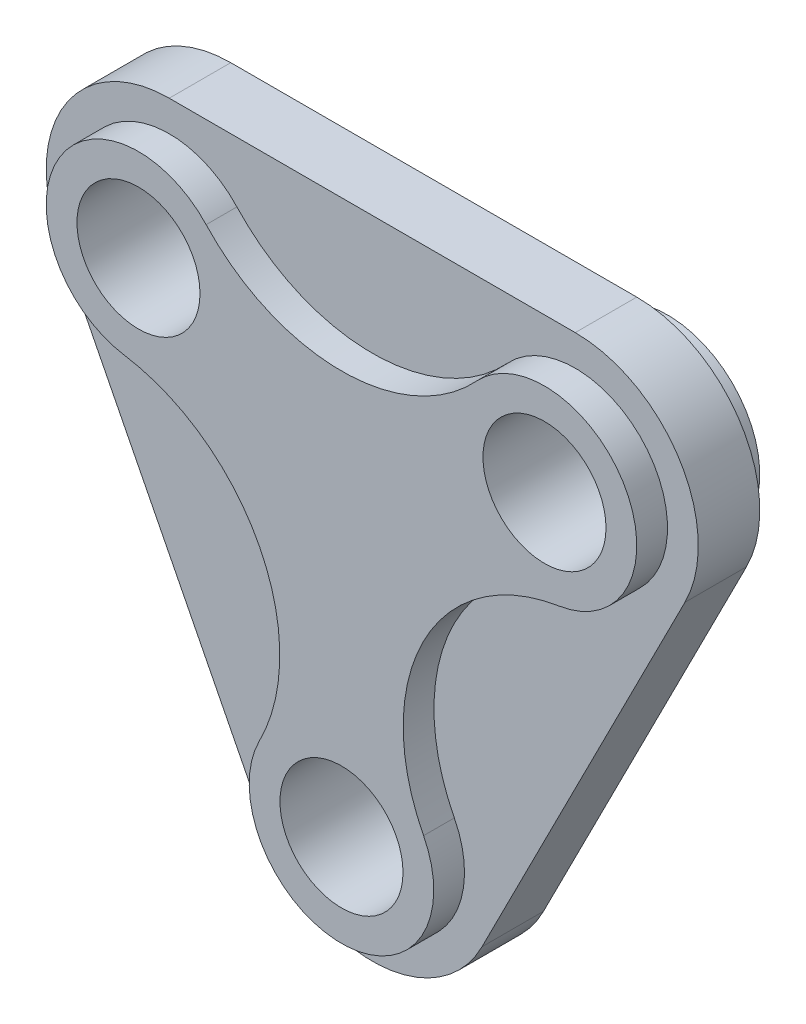
ISO-10303-21;
HEADER;
FILE_DESCRIPTION(('STEP AP214'),'2;1');
FILE_NAME('part.step','',(''),(''),'','','');
FILE_SCHEMA(('AUTOMOTIVE_DESIGN { 1 0 10303 214 1 1 1 1 }'));
ENDSEC;
DATA;
#1=APPLICATION_CONTEXT('core data for automotive mechanical design processes');
#2=APPLICATION_PROTOCOL_DEFINITION('international standard','automotive_design',2000,#1);
#3=PRODUCT_CONTEXT('',#1,'mechanical');
#4=PRODUCT('Part','Part','',(#3));
#5=PRODUCT_RELATED_PRODUCT_CATEGORY('part','',(#4));
#6=PRODUCT_DEFINITION_FORMATION('','',#4);
#7=PRODUCT_DEFINITION_CONTEXT('part definition',#1,'design');
#8=PRODUCT_DEFINITION('design','',#6,#7);
#9=PRODUCT_DEFINITION_SHAPE('','',#8);
#10=(LENGTH_UNIT() NAMED_UNIT(*) SI_UNIT(.MILLI.,.METRE.));
#11=(NAMED_UNIT(*) PLANE_ANGLE_UNIT() SI_UNIT($,.RADIAN.));
#12=(NAMED_UNIT(*) SI_UNIT($,.STERADIAN.) SOLID_ANGLE_UNIT());
#13=UNCERTAINTY_MEASURE_WITH_UNIT(LENGTH_MEASURE(1.E-05),#10,'distance_accuracy_value','');
#14=(GEOMETRIC_REPRESENTATION_CONTEXT(3) GLOBAL_UNCERTAINTY_ASSIGNED_CONTEXT((#13)) GLOBAL_UNIT_ASSIGNED_CONTEXT((#10,
#11,#12)) REPRESENTATION_CONTEXT('',''));
#15=CARTESIAN_POINT('',(0.,0.,0.));
#16=DIRECTION('',(0.,0.,1.));
#17=DIRECTION('',(1.,0.,0.));
#18=AXIS2_PLACEMENT_3D('',#15,#16,#17);
#19=CARTESIAN_POINT('',(0.,95.5941170815567,10.));
#20=DIRECTION('',(0.,0.,-1.));
#21=DIRECTION('',(-1.,0.,0.));
#22=AXIS2_PLACEMENT_3D('',#19,#20,#21);
#23=CYLINDRICAL_SURFACE('',#22,30.);
#24=DIRECTION('',(0.,0.,-1.));
#25=VECTOR('',#24,1.);
#26=CARTESIAN_POINT('',(-22.,75.1980390271856,10.));
#27=LINE('',#26,#25);
#28=CARTESIAN_POINT('',(-22.,75.1980390271856,-5.));
#29=VERTEX_POINT('',#28);
#30=CARTESIAN_POINT('',(-22.,75.1980390271856,-10.));
#31=VERTEX_POINT('',#30);
#32=EDGE_CURVE('E45',#29,#31,#27,.T.);
#33=ORIENTED_EDGE('',*,*,#32,.F.);
#34=CARTESIAN_POINT('',(0.,95.5941170815567,-5.));
#35=DIRECTION('',(0.,0.,1.));
#36=DIRECTION('',(1.,0.,0.));
#37=AXIS2_PLACEMENT_3D('',#34,#35,#36);
#38=CIRCLE('',#37,30.);
#39=CARTESIAN_POINT('',(22.,75.1980390271856,-5.));
#40=VERTEX_POINT('',#39);
#41=EDGE_CURVE('E225',#29,#40,#38,.T.);
#42=ORIENTED_EDGE('',*,*,#41,.T.);
#43=DIRECTION('',(0.,0.,-1.));
#44=VECTOR('',#43,1.);
#45=CARTESIAN_POINT('',(22.,75.1980390271856,10.));
#46=LINE('',#45,#44);
#47=CARTESIAN_POINT('',(22.,75.1980390271856,-10.));
#48=VERTEX_POINT('',#47);
#49=EDGE_CURVE('E272',#40,#48,#46,.T.);
#50=ORIENTED_EDGE('',*,*,#49,.T.);
#51=CARTESIAN_POINT('',(0.,95.5941170815567,-10.));
#52=DIRECTION('',(0.,0.,1.));
#53=DIRECTION('',(1.,0.,0.));
#54=AXIS2_PLACEMENT_3D('',#51,#52,#53);
#55=CIRCLE('',#54,30.);
#56=EDGE_CURVE('E174',#31,#48,#55,.T.);
#57=ORIENTED_EDGE('',*,*,#56,.F.);
#58=EDGE_LOOP('',(#33,#42,#50,#57));
#59=FACE_BOUND('',#58,.T.);
#60=ADVANCED_FACE('F37',(#59),#23,.F.);
#61=CARTESIAN_POINT('',(-33.,65.,10.));
#62=DIRECTION('',(0.,0.,-1.));
#63=DIRECTION('',(-1.,0.,0.));
#64=AXIS2_PLACEMENT_3D('',#61,#62,#63);
#65=CYLINDRICAL_SURFACE('',#64,15.);
#66=CARTESIAN_POINT('',(-33.,65.,-5.));
#67=DIRECTION('',(0.,0.,1.));
#68=DIRECTION('',(1.,0.,0.));
#69=AXIS2_PLACEMENT_3D('',#66,#67,#68);
#70=CIRCLE('',#69,15.);
#71=CARTESIAN_POINT('',(-35.3440777057431,50.1842887545201,-5.));
#72=VERTEX_POINT('',#71);
#73=EDGE_CURVE('E223',#29,#72,#70,.T.);
#74=ORIENTED_EDGE('',*,*,#73,.F.);
#75=ORIENTED_EDGE('',*,*,#32,.T.);
#76=CARTESIAN_POINT('',(-33.,65.,-10.));
#77=DIRECTION('',(0.,0.,1.));
#78=DIRECTION('',(1.,0.,0.));
#79=AXIS2_PLACEMENT_3D('',#76,#77,#78);
#80=CIRCLE('',#79,15.);
#81=CARTESIAN_POINT('',(-35.3440777057431,50.1842887545201,-10.));
#82=VERTEX_POINT('',#81);
#83=EDGE_CURVE('E275',#31,#82,#80,.T.);
#84=ORIENTED_EDGE('',*,*,#83,.T.);
#85=DIRECTION('',(0.,0.,-1.));
#86=VECTOR('',#85,1.);
#87=CARTESIAN_POINT('',(-35.3440777057431,50.1842887545201,10.));
#88=LINE('',#87,#86);
#89=EDGE_CURVE('E310',#72,#82,#88,.T.);
#90=ORIENTED_EDGE('',*,*,#89,.F.);
#91=EDGE_LOOP('',(#74,#75,#84,#90));
#92=FACE_BOUND('',#91,.T.);
#93=ADVANCED_FACE('F325',(#92),#65,.T.);
#94=CARTESIAN_POINT('',(-40.0322331172294,20.5528662635605,10.));
#95=DIRECTION('',(0.,0.,-1.));
#96=DIRECTION('',(-1.,0.,0.));
#97=AXIS2_PLACEMENT_3D('',#94,#95,#96);
#98=CYLINDRICAL_SURFACE('',#97,30.);
#99=CARTESIAN_POINT('',(-40.0322331172294,20.5528662635605,-5.));
#100=DIRECTION('',(0.,0.,1.));
#101=DIRECTION('',(1.,0.,0.));
#102=AXIS2_PLACEMENT_3D('',#99,#100,#101);
#103=CIRCLE('',#102,30.);
#104=CARTESIAN_POINT('',(-13.3440777057431,6.85095542118682,-5.));
#105=VERTEX_POINT('',#104);
#106=EDGE_CURVE('E184',#72,#105,#103,.F.);
#107=ORIENTED_EDGE('',*,*,#106,.F.);
#108=ORIENTED_EDGE('',*,*,#89,.T.);
#109=CARTESIAN_POINT('',(-40.0322331172294,20.5528662635605,-10.));
#110=DIRECTION('',(0.,0.,1.));
#111=DIRECTION('',(1.,0.,0.));
#112=AXIS2_PLACEMENT_3D('',#109,#110,#111);
#113=CIRCLE('',#112,30.);
#114=CARTESIAN_POINT('',(-13.3440777057431,6.85095542118682,-10.));
#115=VERTEX_POINT('',#114);
#116=EDGE_CURVE('E278',#82,#115,#113,.F.);
#117=ORIENTED_EDGE('',*,*,#116,.T.);
#118=DIRECTION('',(0.,0.,-1.));
#119=VECTOR('',#118,1.);
#120=CARTESIAN_POINT('',(-13.3440777057431,6.85095542118682,10.));
#121=LINE('',#120,#119);
#122=EDGE_CURVE('E307',#105,#115,#121,.T.);
#123=ORIENTED_EDGE('',*,*,#122,.F.);
#124=EDGE_LOOP('',(#107,#108,#117,#123));
#125=FACE_BOUND('',#124,.T.);
#126=ADVANCED_FACE('F318',(#125),#98,.F.);
#127=CARTESIAN_POINT('',(0.,0.,10.));
#128=DIRECTION('',(0.,0.,-1.));
#129=DIRECTION('',(-1.,0.,0.));
#130=AXIS2_PLACEMENT_3D('',#127,#128,#129);
#131=CYLINDRICAL_SURFACE('',#130,15.);
#132=CARTESIAN_POINT('',(0.,0.,-5.));
#133=DIRECTION('',(0.,0.,1.));
#134=DIRECTION('',(1.,0.,0.));
#135=AXIS2_PLACEMENT_3D('',#132,#133,#134);
#136=CIRCLE('',#135,15.);
#137=CARTESIAN_POINT('',(13.3440777057431,6.85095542118682,-5.));
#138=VERTEX_POINT('',#137);
#139=EDGE_CURVE('E234',#105,#138,#136,.T.);
#140=ORIENTED_EDGE('',*,*,#139,.F.);
#141=ORIENTED_EDGE('',*,*,#122,.T.);
#142=CARTESIAN_POINT('',(0.,0.,-10.));
#143=DIRECTION('',(0.,0.,1.));
#144=DIRECTION('',(1.,0.,0.));
#145=AXIS2_PLACEMENT_3D('',#142,#143,#144);
#146=CIRCLE('',#145,15.);
#147=CARTESIAN_POINT('',(13.3440777057431,6.85095542118682,-10.));
#148=VERTEX_POINT('',#147);
#149=EDGE_CURVE('E281',#115,#148,#146,.T.);
#150=ORIENTED_EDGE('',*,*,#149,.T.);
#151=DIRECTION('',(0.,0.,-1.));
#152=VECTOR('',#151,1.);
#153=CARTESIAN_POINT('',(13.3440777057431,6.85095542118682,10.));
#154=LINE('',#153,#152);
#155=EDGE_CURVE('E303',#138,#148,#154,.T.);
#156=ORIENTED_EDGE('',*,*,#155,.F.);
#157=EDGE_LOOP('',(#140,#141,#150,#156));
#158=FACE_BOUND('',#157,.T.);
#159=ADVANCED_FACE('F335',(#158),#131,.T.);
#160=CARTESIAN_POINT('',(40.0322331172294,20.5528662635605,10.));
#161=DIRECTION('',(0.,0.,-1.));
#162=DIRECTION('',(-1.,0.,0.));
#163=AXIS2_PLACEMENT_3D('',#160,#161,#162);
#164=CYLINDRICAL_SURFACE('',#163,30.);
#165=DIRECTION('',(0.,0.,-1.));
#166=VECTOR('',#165,1.);
#167=CARTESIAN_POINT('',(35.3440777057431,50.1842887545201,10.));
#168=LINE('',#167,#166);
#169=CARTESIAN_POINT('',(35.3440777057431,50.1842887545201,-5.));
#170=VERTEX_POINT('',#169);
#171=CARTESIAN_POINT('',(35.3440777057431,50.1842887545201,-10.));
#172=VERTEX_POINT('',#171);
#173=EDGE_CURVE('E300',#170,#172,#168,.T.);
#174=ORIENTED_EDGE('',*,*,#173,.F.);
#175=CARTESIAN_POINT('',(40.0322331172294,20.5528662635605,-5.));
#176=DIRECTION('',(0.,0.,1.));
#177=DIRECTION('',(1.,0.,0.));
#178=AXIS2_PLACEMENT_3D('',#175,#176,#177);
#179=CIRCLE('',#178,30.);
#180=EDGE_CURVE('E231',#170,#138,#179,.T.);
#181=ORIENTED_EDGE('',*,*,#180,.T.);
#182=ORIENTED_EDGE('',*,*,#155,.T.);
#183=CARTESIAN_POINT('',(40.0322331172294,20.5528662635605,-10.));
#184=DIRECTION('',(0.,0.,1.));
#185=DIRECTION('',(1.,0.,0.));
#186=AXIS2_PLACEMENT_3D('',#183,#184,#185);
#187=CIRCLE('',#186,30.);
#188=EDGE_CURVE('E284',#172,#148,#187,.T.);
#189=ORIENTED_EDGE('',*,*,#188,.F.);
#190=EDGE_LOOP('',(#174,#181,#182,#189));
#191=FACE_BOUND('',#190,.T.);
#192=ADVANCED_FACE('F340',(#191),#164,.F.);
#193=CARTESIAN_POINT('',(33.,65.,10.));
#194=DIRECTION('',(0.,0.,-1.));
#195=DIRECTION('',(-1.,0.,0.));
#196=AXIS2_PLACEMENT_3D('',#193,#194,#195);
#197=CYLINDRICAL_SURFACE('',#196,15.);
#198=ORIENTED_EDGE('',*,*,#49,.F.);
#199=CARTESIAN_POINT('',(33.,65.,-5.));
#200=DIRECTION('',(0.,0.,1.));
#201=DIRECTION('',(1.,0.,0.));
#202=AXIS2_PLACEMENT_3D('',#199,#200,#201);
#203=CIRCLE('',#202,15.);
#204=EDGE_CURVE('E228',#40,#170,#203,.F.);
#205=ORIENTED_EDGE('',*,*,#204,.T.);
#206=ORIENTED_EDGE('',*,*,#173,.T.);
#207=CARTESIAN_POINT('',(33.,65.,-10.));
#208=DIRECTION('',(0.,0.,1.));
#209=DIRECTION('',(1.,0.,0.));
#210=AXIS2_PLACEMENT_3D('',#207,#208,#209);
#211=CIRCLE('',#210,15.);
#212=EDGE_CURVE('E287',#48,#172,#211,.F.);
#213=ORIENTED_EDGE('',*,*,#212,.F.);
#214=EDGE_LOOP('',(#198,#205,#206,#213));
#215=FACE_BOUND('',#214,.T.);
#216=ADVANCED_FACE('F344',(#215),#197,.T.);
#217=CARTESIAN_POINT('',(0.,95.5941170815567,5.));
#218=DIRECTION('',(0.,0.,1.));
#219=DIRECTION('',(1.,0.,0.));
#220=AXIS2_PLACEMENT_3D('',#217,#218,#219);
#221=CIRCLE('',#220,30.);
#222=CARTESIAN_POINT('',(-22.,75.1980390271856,5.));
#223=VERTEX_POINT('',#222);
#224=CARTESIAN_POINT('',(22.,75.1980390271856,5.));
#225=VERTEX_POINT('',#224);
#226=EDGE_CURVE('E52',#223,#225,#221,.T.);
#227=ORIENTED_EDGE('',*,*,#226,.F.);
#228=CARTESIAN_POINT('',(-22.,75.1980390271856,10.));
#229=VERTEX_POINT('',#228);
#230=EDGE_CURVE('E11',#229,#223,#27,.T.);
#231=ORIENTED_EDGE('',*,*,#230,.F.);
#232=CARTESIAN_POINT('',(0.,95.5941170815567,10.));
#233=DIRECTION('',(0.,0.,1.));
#234=DIRECTION('',(1.,0.,0.));
#235=AXIS2_PLACEMENT_3D('',#232,#233,#234);
#236=CIRCLE('',#235,30.);
#237=CARTESIAN_POINT('',(22.,75.1980390271856,10.));
#238=VERTEX_POINT('',#237);
#239=EDGE_CURVE('E247',#229,#238,#236,.T.);
#240=ORIENTED_EDGE('',*,*,#239,.T.);
#241=EDGE_CURVE('E298',#238,#225,#46,.T.);
#242=ORIENTED_EDGE('',*,*,#241,.T.);
#243=EDGE_LOOP('',(#227,#231,#240,#242));
#244=FACE_BOUND('',#243,.T.);
#245=ADVANCED_FACE('F39',(#244),#23,.F.);
#246=ORIENTED_EDGE('',*,*,#230,.T.);
#247=CARTESIAN_POINT('',(-33.,65.,5.));
#248=DIRECTION('',(0.,0.,1.));
#249=DIRECTION('',(1.,0.,0.));
#250=AXIS2_PLACEMENT_3D('',#247,#248,#249);
#251=CIRCLE('',#250,15.);
#252=CARTESIAN_POINT('',(-35.3440777057431,50.1842887545201,5.));
#253=VERTEX_POINT('',#252);
#254=EDGE_CURVE('E58',#223,#253,#251,.T.);
#255=ORIENTED_EDGE('',*,*,#254,.T.);
#256=CARTESIAN_POINT('',(-35.3440777057431,50.1842887545201,10.));
#257=VERTEX_POINT('',#256);
#258=EDGE_CURVE('E311',#257,#253,#88,.T.);
#259=ORIENTED_EDGE('',*,*,#258,.F.);
#260=CARTESIAN_POINT('',(-33.,65.,10.));
#261=DIRECTION('',(0.,0.,1.));
#262=DIRECTION('',(1.,0.,0.));
#263=AXIS2_PLACEMENT_3D('',#260,#261,#262);
#264=CIRCLE('',#263,15.);
#265=EDGE_CURVE('E250',#229,#257,#264,.T.);
#266=ORIENTED_EDGE('',*,*,#265,.F.);
#267=EDGE_LOOP('',(#246,#255,#259,#266));
#268=FACE_BOUND('',#267,.T.);
#269=ADVANCED_FACE('F350',(#268),#65,.T.);
#270=ORIENTED_EDGE('',*,*,#258,.T.);
#271=CARTESIAN_POINT('',(-40.0322331172294,20.5528662635605,5.));
#272=DIRECTION('',(0.,0.,1.));
#273=DIRECTION('',(1.,0.,0.));
#274=AXIS2_PLACEMENT_3D('',#271,#272,#273);
#275=CIRCLE('',#274,30.);
#276=CARTESIAN_POINT('',(-13.3440777057431,6.85095542118682,5.));
#277=VERTEX_POINT('',#276);
#278=EDGE_CURVE('E207',#253,#277,#275,.F.);
#279=ORIENTED_EDGE('',*,*,#278,.T.);
#280=CARTESIAN_POINT('',(-13.3440777057431,6.85095542118682,10.));
#281=VERTEX_POINT('',#280);
#282=EDGE_CURVE('E308',#281,#277,#121,.T.);
#283=ORIENTED_EDGE('',*,*,#282,.F.);
#284=CARTESIAN_POINT('',(-40.0322331172294,20.5528662635605,10.));
#285=DIRECTION('',(0.,0.,1.));
#286=DIRECTION('',(1.,0.,0.));
#287=AXIS2_PLACEMENT_3D('',#284,#285,#286);
#288=CIRCLE('',#287,30.);
#289=EDGE_CURVE('E253',#257,#281,#288,.F.);
#290=ORIENTED_EDGE('',*,*,#289,.F.);
#291=EDGE_LOOP('',(#270,#279,#283,#290));
#292=FACE_BOUND('',#291,.T.);
#293=ADVANCED_FACE('F356',(#292),#98,.F.);
#294=ORIENTED_EDGE('',*,*,#282,.T.);
#295=CARTESIAN_POINT('',(0.,0.,5.));
#296=DIRECTION('',(0.,0.,1.));
#297=DIRECTION('',(1.,0.,0.));
#298=AXIS2_PLACEMENT_3D('',#295,#296,#297);
#299=CIRCLE('',#298,15.);
#300=CARTESIAN_POINT('',(13.3440777057431,6.85095542118682,5.));
#301=VERTEX_POINT('',#300);
#302=EDGE_CURVE('E205',#277,#301,#299,.T.);
#303=ORIENTED_EDGE('',*,*,#302,.T.);
#304=CARTESIAN_POINT('',(13.3440777057431,6.85095542118682,10.));
#305=VERTEX_POINT('',#304);
#306=EDGE_CURVE('E304',#305,#301,#154,.T.);
#307=ORIENTED_EDGE('',*,*,#306,.F.);
#308=CARTESIAN_POINT('',(0.,0.,10.));
#309=DIRECTION('',(0.,0.,1.));
#310=DIRECTION('',(1.,0.,0.));
#311=AXIS2_PLACEMENT_3D('',#308,#309,#310);
#312=CIRCLE('',#311,15.);
#313=EDGE_CURVE('E255',#281,#305,#312,.T.);
#314=ORIENTED_EDGE('',*,*,#313,.F.);
#315=EDGE_LOOP('',(#294,#303,#307,#314));
#316=FACE_BOUND('',#315,.T.);
#317=ADVANCED_FACE('F385',(#316),#131,.T.);
#318=CARTESIAN_POINT('',(40.0322331172294,20.5528662635605,5.));
#319=DIRECTION('',(0.,0.,1.));
#320=DIRECTION('',(1.,0.,0.));
#321=AXIS2_PLACEMENT_3D('',#318,#319,#320);
#322=CIRCLE('',#321,30.);
#323=CARTESIAN_POINT('',(35.3440777057431,50.1842887545201,5.));
#324=VERTEX_POINT('',#323);
#325=EDGE_CURVE('E202',#324,#301,#322,.T.);
#326=ORIENTED_EDGE('',*,*,#325,.F.);
#327=CARTESIAN_POINT('',(35.3440777057431,50.1842887545201,10.));
#328=VERTEX_POINT('',#327);
#329=EDGE_CURVE('E301',#328,#324,#168,.T.);
#330=ORIENTED_EDGE('',*,*,#329,.F.);
#331=CARTESIAN_POINT('',(40.0322331172294,20.5528662635605,10.));
#332=DIRECTION('',(0.,0.,1.));
#333=DIRECTION('',(1.,0.,0.));
#334=AXIS2_PLACEMENT_3D('',#331,#332,#333);
#335=CIRCLE('',#334,30.);
#336=EDGE_CURVE('E257',#328,#305,#335,.T.);
#337=ORIENTED_EDGE('',*,*,#336,.T.);
#338=ORIENTED_EDGE('',*,*,#306,.T.);
#339=EDGE_LOOP('',(#326,#330,#337,#338));
#340=FACE_BOUND('',#339,.T.);
#341=ADVANCED_FACE('F363',(#340),#164,.F.);
#342=CARTESIAN_POINT('',(-33.,65.,10.));
#343=DIRECTION('',(0.,0.,-1.));
#344=DIRECTION('',(-1.,0.,0.));
#345=AXIS2_PLACEMENT_3D('',#342,#343,#344);
#346=CYLINDRICAL_SURFACE('',#345,10.);
#347=CARTESIAN_POINT('',(-33.,65.,10.));
#348=DIRECTION('',(0.,0.,1.));
#349=DIRECTION('',(1.,0.,0.));
#350=AXIS2_PLACEMENT_3D('',#347,#348,#349);
#351=CIRCLE('',#350,10.);
#352=CARTESIAN_POINT('',(-23.,65.,10.));
#353=VERTEX_POINT('',#352);
#354=EDGE_CURVE('E266',#353,#353,#351,.T.);
#355=ORIENTED_EDGE('',*,*,#354,.T.);
#356=EDGE_LOOP('',(#355));
#357=FACE_BOUND('',#356,.T.);
#358=CARTESIAN_POINT('',(-33.,65.,-10.));
#359=DIRECTION('',(0.,0.,1.));
#360=DIRECTION('',(1.,0.,0.));
#361=AXIS2_PLACEMENT_3D('',#358,#359,#360);
#362=CIRCLE('',#361,10.);
#363=CARTESIAN_POINT('',(-23.,65.,-10.));
#364=VERTEX_POINT('',#363);
#365=EDGE_CURVE('E293',#364,#364,#362,.T.);
#366=ORIENTED_EDGE('',*,*,#365,.F.);
#367=EDGE_LOOP('',(#366));
#368=FACE_BOUND('',#367,.T.);
#369=ADVANCED_FACE('F376',(#357,#368),#346,.F.);
#370=CARTESIAN_POINT('',(0.,0.,10.));
#371=DIRECTION('',(0.,0.,-1.));
#372=DIRECTION('',(-1.,0.,0.));
#373=AXIS2_PLACEMENT_3D('',#370,#371,#372);
#374=CYLINDRICAL_SURFACE('',#373,10.);
#375=CARTESIAN_POINT('',(0.,0.,10.));
#376=DIRECTION('',(0.,0.,1.));
#377=DIRECTION('',(1.,0.,0.));
#378=AXIS2_PLACEMENT_3D('',#375,#376,#377);
#379=CIRCLE('',#378,10.);
#380=CARTESIAN_POINT('',(10.,0.,10.));
#381=VERTEX_POINT('',#380);
#382=EDGE_CURVE('E263',#381,#381,#379,.T.);
#383=ORIENTED_EDGE('',*,*,#382,.T.);
#384=EDGE_LOOP('',(#383));
#385=FACE_BOUND('',#384,.T.);
#386=CARTESIAN_POINT('',(0.,0.,-10.));
#387=DIRECTION('',(0.,0.,1.));
#388=DIRECTION('',(1.,0.,0.));
#389=AXIS2_PLACEMENT_3D('',#386,#387,#388);
#390=CIRCLE('',#389,10.);
#391=CARTESIAN_POINT('',(10.,0.,-10.));
#392=VERTEX_POINT('',#391);
#393=EDGE_CURVE('E290',#392,#392,#390,.T.);
#394=ORIENTED_EDGE('',*,*,#393,.F.);
#395=EDGE_LOOP('',(#394));
#396=FACE_BOUND('',#395,.T.);
#397=ADVANCED_FACE('F367',(#385,#396),#374,.F.);
#398=CARTESIAN_POINT('',(33.,65.,5.));
#399=DIRECTION('',(0.,0.,1.));
#400=DIRECTION('',(1.,0.,0.));
#401=AXIS2_PLACEMENT_3D('',#398,#399,#400);
#402=CIRCLE('',#401,15.);
#403=EDGE_CURVE('E199',#225,#324,#402,.F.);
#404=ORIENTED_EDGE('',*,*,#403,.F.);
#405=ORIENTED_EDGE('',*,*,#241,.F.);
#406=CARTESIAN_POINT('',(33.,65.,10.));
#407=DIRECTION('',(0.,0.,1.));
#408=DIRECTION('',(1.,0.,0.));
#409=AXIS2_PLACEMENT_3D('',#406,#407,#408);
#410=CIRCLE('',#409,15.);
#411=EDGE_CURVE('E260',#238,#328,#410,.F.);
#412=ORIENTED_EDGE('',*,*,#411,.T.);
#413=ORIENTED_EDGE('',*,*,#329,.T.);
#414=EDGE_LOOP('',(#404,#405,#412,#413));
#415=FACE_BOUND('',#414,.T.);
#416=ADVANCED_FACE('F358',(#415),#197,.T.);
#417=CARTESIAN_POINT('',(33.,65.,10.));
#418=DIRECTION('',(0.,0.,-1.));
#419=DIRECTION('',(-1.,0.,0.));
#420=AXIS2_PLACEMENT_3D('',#417,#418,#419);
#421=CYLINDRICAL_SURFACE('',#420,10.);
#422=CARTESIAN_POINT('',(33.,65.,10.));
#423=DIRECTION('',(0.,0.,1.));
#424=DIRECTION('',(1.,0.,0.));
#425=AXIS2_PLACEMENT_3D('',#422,#423,#424);
#426=CIRCLE('',#425,10.);
#427=CARTESIAN_POINT('',(43.,65.,10.));
#428=VERTEX_POINT('',#427);
#429=EDGE_CURVE('E269',#428,#428,#426,.F.);
#430=ORIENTED_EDGE('',*,*,#429,.F.);
#431=EDGE_LOOP('',(#430));
#432=FACE_BOUND('',#431,.T.);
#433=CARTESIAN_POINT('',(33.,65.,-10.));
#434=DIRECTION('',(0.,0.,1.));
#435=DIRECTION('',(1.,0.,0.));
#436=AXIS2_PLACEMENT_3D('',#433,#434,#435);
#437=CIRCLE('',#436,10.);
#438=CARTESIAN_POINT('',(43.,65.,-10.));
#439=VERTEX_POINT('',#438);
#440=EDGE_CURVE('E251',#439,#439,#437,.F.);
#441=ORIENTED_EDGE('',*,*,#440,.T.);
#442=EDGE_LOOP('',(#441));
#443=FACE_BOUND('',#442,.T.);
#444=ADVANCED_FACE('F366',(#432,#443),#421,.F.);
#445=CARTESIAN_POINT('',(0.,0.,10.));
#446=DIRECTION('',(0.,0.,1.));
#447=DIRECTION('',(1.,0.,0.));
#448=AXIS2_PLACEMENT_3D('',#445,#446,#447);
#449=PLANE('',#448);
#450=ORIENTED_EDGE('',*,*,#239,.F.);
#451=ORIENTED_EDGE('',*,*,#265,.T.);
#452=ORIENTED_EDGE('',*,*,#289,.T.);
#453=ORIENTED_EDGE('',*,*,#313,.T.);
#454=ORIENTED_EDGE('',*,*,#336,.F.);
#455=ORIENTED_EDGE('',*,*,#411,.F.);
#456=EDGE_LOOP('',(#450,#451,#452,#453,#454,#455));
#457=FACE_BOUND('',#456,.T.);
#458=ORIENTED_EDGE('',*,*,#382,.F.);
#459=EDGE_LOOP('',(#458));
#460=FACE_BOUND('',#459,.T.);
#461=ORIENTED_EDGE('',*,*,#354,.F.);
#462=EDGE_LOOP('',(#461));
#463=FACE_BOUND('',#462,.T.);
#464=ORIENTED_EDGE('',*,*,#429,.T.);
#465=EDGE_LOOP('',(#464));
#466=FACE_BOUND('',#465,.T.);
#467=ADVANCED_FACE('F373',(#457,#460,#463,#466),#449,.T.);
#468=CARTESIAN_POINT('',(0.,0.,-10.));
#469=DIRECTION('',(0.,0.,1.));
#470=DIRECTION('',(1.,0.,0.));
#471=AXIS2_PLACEMENT_3D('',#468,#469,#470);
#472=PLANE('',#471);
#473=ORIENTED_EDGE('',*,*,#56,.T.);
#474=ORIENTED_EDGE('',*,*,#212,.T.);
#475=ORIENTED_EDGE('',*,*,#188,.T.);
#476=ORIENTED_EDGE('',*,*,#149,.F.);
#477=ORIENTED_EDGE('',*,*,#116,.F.);
#478=ORIENTED_EDGE('',*,*,#83,.F.);
#479=EDGE_LOOP('',(#473,#474,#475,#476,#477,#478));
#480=FACE_BOUND('',#479,.T.);
#481=ORIENTED_EDGE('',*,*,#393,.T.);
#482=EDGE_LOOP('',(#481));
#483=FACE_BOUND('',#482,.T.);
#484=ORIENTED_EDGE('',*,*,#365,.T.);
#485=EDGE_LOOP('',(#484));
#486=FACE_BOUND('',#485,.T.);
#487=ORIENTED_EDGE('',*,*,#440,.F.);
#488=EDGE_LOOP('',(#487));
#489=FACE_BOUND('',#488,.T.);
#490=ADVANCED_FACE('F329',(#480,#483,#486,#489),#472,.F.);
#491=CARTESIAN_POINT('',(33.,65.,5.));
#492=DIRECTION('',(0.,0.,-1.));
#493=DIRECTION('',(-1.,0.,0.));
#494=AXIS2_PLACEMENT_3D('',#491,#492,#493);
#495=CYLINDRICAL_SURFACE('',#494,20.);
#496=CARTESIAN_POINT('',(33.,65.,-5.));
#497=DIRECTION('',(0.,0.,1.));
#498=DIRECTION('',(1.,0.,0.));
#499=AXIS2_PLACEMENT_3D('',#496,#497,#498);
#500=CIRCLE('',#499,20.);
#501=CARTESIAN_POINT('',(33.,85.,-5.));
#502=VERTEX_POINT('',#501);
#503=CARTESIAN_POINT('',(50.8333353851637,55.9461528044554,-5.));
#504=VERTEX_POINT('',#503);
#505=EDGE_CURVE('E169',#502,#504,#500,.F.);
#506=ORIENTED_EDGE('',*,*,#505,.F.);
#507=DIRECTION('',(0.,0.,-1.));
#508=VECTOR('',#507,1.);
#509=CARTESIAN_POINT('',(33.,85.,5.));
#510=LINE('',#509,#508);
#511=CARTESIAN_POINT('',(33.,85.,5.));
#512=VERTEX_POINT('',#511);
#513=EDGE_CURVE('E163',#512,#502,#510,.T.);
#514=ORIENTED_EDGE('',*,*,#513,.F.);
#515=CARTESIAN_POINT('',(33.,65.,5.));
#516=DIRECTION('',(0.,0.,1.));
#517=DIRECTION('',(1.,0.,0.));
#518=AXIS2_PLACEMENT_3D('',#515,#516,#517);
#519=CIRCLE('',#518,20.);
#520=CARTESIAN_POINT('',(50.8333353851637,55.9461528044554,5.));
#521=VERTEX_POINT('',#520);
#522=EDGE_CURVE('E166',#512,#521,#519,.F.);
#523=ORIENTED_EDGE('',*,*,#522,.T.);
#524=DIRECTION('',(0.,0.,-1.));
#525=VECTOR('',#524,1.);
#526=CARTESIAN_POINT('',(50.8333353851637,55.9461528044554,5.));
#527=LINE('',#526,#525);
#528=EDGE_CURVE('E209',#521,#504,#527,.T.);
#529=ORIENTED_EDGE('',*,*,#528,.T.);
#530=EDGE_LOOP('',(#506,#514,#523,#529));
#531=FACE_BOUND('',#530,.T.);
#532=ADVANCED_FACE('F165',(#531),#495,.T.);
#533=CARTESIAN_POINT('',(0.,85.,5.));
#534=DIRECTION('',(0.,1.,0.));
#535=DIRECTION('',(0.,0.,1.));
#536=AXIS2_PLACEMENT_3D('',#533,#534,#535);
#537=PLANE('',#536);
#538=DIRECTION('',(1.,0.,0.));
#539=VECTOR('',#538,1.);
#540=CARTESIAN_POINT('',(0.,85.,-5.));
#541=LINE('',#540,#539);
#542=CARTESIAN_POINT('',(-33.,85.,-5.));
#543=VERTEX_POINT('',#542);
#544=EDGE_CURVE('E211',#543,#502,#541,.T.);
#545=ORIENTED_EDGE('',*,*,#544,.F.);
#546=DIRECTION('',(0.,0.,-1.));
#547=VECTOR('',#546,1.);
#548=CARTESIAN_POINT('',(-33.,85.,5.));
#549=LINE('',#548,#547);
#550=CARTESIAN_POINT('',(-33.,85.,5.));
#551=VERTEX_POINT('',#550);
#552=EDGE_CURVE('E175',#551,#543,#549,.T.);
#553=ORIENTED_EDGE('',*,*,#552,.F.);
#554=DIRECTION('',(1.,0.,0.));
#555=VECTOR('',#554,1.);
#556=CARTESIAN_POINT('',(0.,85.,5.));
#557=LINE('',#556,#555);
#558=EDGE_CURVE('E181',#551,#512,#557,.T.);
#559=ORIENTED_EDGE('',*,*,#558,.T.);
#560=ORIENTED_EDGE('',*,*,#513,.T.);
#561=EDGE_LOOP('',(#545,#553,#559,#560));
#562=FACE_BOUND('',#561,.T.);
#563=ADVANCED_FACE('F186',(#562),#537,.T.);
#564=CARTESIAN_POINT('',(-33.,65.,5.));
#565=DIRECTION('',(0.,0.,-1.));
#566=DIRECTION('',(-1.,0.,0.));
#567=AXIS2_PLACEMENT_3D('',#564,#565,#566);
#568=CYLINDRICAL_SURFACE('',#567,20.);
#569=CARTESIAN_POINT('',(-33.,65.,-5.));
#570=DIRECTION('',(0.,0.,1.));
#571=DIRECTION('',(1.,0.,0.));
#572=AXIS2_PLACEMENT_3D('',#569,#570,#571);
#573=CIRCLE('',#572,20.);
#574=CARTESIAN_POINT('',(-50.8333353851637,55.9461528044554,-5.));
#575=VERTEX_POINT('',#574);
#576=EDGE_CURVE('E213',#543,#575,#573,.T.);
#577=ORIENTED_EDGE('',*,*,#576,.T.);
#578=DIRECTION('',(0.,0.,-1.));
#579=VECTOR('',#578,1.);
#580=CARTESIAN_POINT('',(-50.8333353851637,55.9461528044554,5.));
#581=LINE('',#580,#579);
#582=CARTESIAN_POINT('',(-50.8333353851637,55.9461528044554,5.));
#583=VERTEX_POINT('',#582);
#584=EDGE_CURVE('E243',#583,#575,#581,.T.);
#585=ORIENTED_EDGE('',*,*,#584,.F.);
#586=CARTESIAN_POINT('',(-33.,65.,5.));
#587=DIRECTION('',(0.,0.,1.));
#588=DIRECTION('',(1.,0.,0.));
#589=AXIS2_PLACEMENT_3D('',#586,#587,#588);
#590=CIRCLE('',#589,20.);
#591=EDGE_CURVE('E188',#551,#583,#590,.T.);
#592=ORIENTED_EDGE('',*,*,#591,.F.);
#593=ORIENTED_EDGE('',*,*,#552,.T.);
#594=EDGE_LOOP('',(#577,#585,#592,#593));
#595=FACE_BOUND('',#594,.T.);
#596=ADVANCED_FACE('F476',(#595),#568,.T.);
#597=CARTESIAN_POINT('',(-17.8333353851636,-9.05384719554462,5.));
#598=DIRECTION('',(0.891666769258181,0.452692359777231,0.));
#599=DIRECTION('',(-0.452692359777231,0.891666769258181,0.));
#600=AXIS2_PLACEMENT_3D('',#597,#598,#599);
#601=PLANE('',#600);
#602=DIRECTION('',(0.452692359777231,-0.891666769258181,0.));
#603=VECTOR('',#602,1.);
#604=CARTESIAN_POINT('',(-17.8333353851636,-9.05384719554462,-5.));
#605=LINE('',#604,#603);
#606=CARTESIAN_POINT('',(-17.8333353851636,-9.05384719554462,-5.));
#607=VERTEX_POINT('',#606);
#608=EDGE_CURVE('E215',#575,#607,#605,.T.);
#609=ORIENTED_EDGE('',*,*,#608,.T.);
#610=DIRECTION('',(0.,0.,-1.));
#611=VECTOR('',#610,1.);
#612=CARTESIAN_POINT('',(-17.8333353851636,-9.05384719554462,5.));
#613=LINE('',#612,#611);
#614=CARTESIAN_POINT('',(-17.8333353851636,-9.05384719554462,5.));
#615=VERTEX_POINT('',#614);
#616=EDGE_CURVE('E240',#615,#607,#613,.T.);
#617=ORIENTED_EDGE('',*,*,#616,.F.);
#618=DIRECTION('',(0.452692359777231,-0.891666769258181,0.));
#619=VECTOR('',#618,1.);
#620=CARTESIAN_POINT('',(-17.8333353851636,-9.05384719554462,5.));
#621=LINE('',#620,#619);
#622=EDGE_CURVE('E190',#583,#615,#621,.T.);
#623=ORIENTED_EDGE('',*,*,#622,.F.);
#624=ORIENTED_EDGE('',*,*,#584,.T.);
#625=EDGE_LOOP('',(#609,#617,#623,#624));
#626=FACE_BOUND('',#625,.T.);
#627=ADVANCED_FACE('F486',(#626),#601,.F.);
#628=CARTESIAN_POINT('',(0.,0.,5.));
#629=DIRECTION('',(0.,0.,-1.));
#630=DIRECTION('',(-1.,0.,0.));
#631=AXIS2_PLACEMENT_3D('',#628,#629,#630);
#632=CYLINDRICAL_SURFACE('',#631,20.);
#633=CARTESIAN_POINT('',(0.,0.,-5.));
#634=DIRECTION('',(0.,0.,1.));
#635=DIRECTION('',(1.,0.,0.));
#636=AXIS2_PLACEMENT_3D('',#633,#634,#635);
#637=CIRCLE('',#636,20.);
#638=CARTESIAN_POINT('',(17.8333353851636,-9.05384719554462,-5.));
#639=VERTEX_POINT('',#638);
#640=EDGE_CURVE('E217',#607,#639,#637,.T.);
#641=ORIENTED_EDGE('',*,*,#640,.T.);
#642=DIRECTION('',(0.,0.,-1.));
#643=VECTOR('',#642,1.);
#644=CARTESIAN_POINT('',(17.8333353851636,-9.05384719554462,5.));
#645=LINE('',#644,#643);
#646=CARTESIAN_POINT('',(17.8333353851636,-9.05384719554462,5.));
#647=VERTEX_POINT('',#646);
#648=EDGE_CURVE('E238',#647,#639,#645,.T.);
#649=ORIENTED_EDGE('',*,*,#648,.F.);
#650=CARTESIAN_POINT('',(0.,0.,5.));
#651=DIRECTION('',(0.,0.,1.));
#652=DIRECTION('',(1.,0.,0.));
#653=AXIS2_PLACEMENT_3D('',#650,#651,#652);
#654=CIRCLE('',#653,20.);
#655=EDGE_CURVE('E194',#615,#647,#654,.T.);
#656=ORIENTED_EDGE('',*,*,#655,.F.);
#657=ORIENTED_EDGE('',*,*,#616,.T.);
#658=EDGE_LOOP('',(#641,#649,#656,#657));
#659=FACE_BOUND('',#658,.T.);
#660=ADVANCED_FACE('F497',(#659),#632,.T.);
#661=CARTESIAN_POINT('',(17.8333353851636,-9.05384719554462,5.));
#662=DIRECTION('',(0.891666769258181,-0.452692359777231,0.));
#663=DIRECTION('',(0.452692359777231,0.891666769258181,0.));
#664=AXIS2_PLACEMENT_3D('',#661,#662,#663);
#665=PLANE('',#664);
#666=DIRECTION('',(-0.452692359777231,-0.891666769258181,0.));
#667=VECTOR('',#666,1.);
#668=CARTESIAN_POINT('',(17.8333353851636,-9.05384719554462,-5.));
#669=LINE('',#668,#667);
#670=EDGE_CURVE('E220',#504,#639,#669,.T.);
#671=ORIENTED_EDGE('',*,*,#670,.F.);
#672=ORIENTED_EDGE('',*,*,#528,.F.);
#673=DIRECTION('',(-0.452692359777231,-0.891666769258181,0.));
#674=VECTOR('',#673,1.);
#675=CARTESIAN_POINT('',(17.8333353851636,-9.05384719554462,5.));
#676=LINE('',#675,#674);
#677=EDGE_CURVE('E183',#521,#647,#676,.T.);
#678=ORIENTED_EDGE('',*,*,#677,.T.);
#679=ORIENTED_EDGE('',*,*,#648,.T.);
#680=EDGE_LOOP('',(#671,#672,#678,#679));
#681=FACE_BOUND('',#680,.T.);
#682=ADVANCED_FACE('F508',(#681),#665,.T.);
#683=CARTESIAN_POINT('',(0.,0.,5.));
#684=DIRECTION('',(0.,0.,1.));
#685=DIRECTION('',(1.,0.,0.));
#686=AXIS2_PLACEMENT_3D('',#683,#684,#685);
#687=PLANE('',#686);
#688=ORIENTED_EDGE('',*,*,#522,.F.);
#689=ORIENTED_EDGE('',*,*,#558,.F.);
#690=ORIENTED_EDGE('',*,*,#591,.T.);
#691=ORIENTED_EDGE('',*,*,#622,.T.);
#692=ORIENTED_EDGE('',*,*,#655,.T.);
#693=ORIENTED_EDGE('',*,*,#677,.F.);
#694=EDGE_LOOP('',(#688,#689,#690,#691,#692,#693));
#695=FACE_BOUND('',#694,.T.);
#696=ORIENTED_EDGE('',*,*,#254,.F.);
#697=ORIENTED_EDGE('',*,*,#226,.T.);
#698=ORIENTED_EDGE('',*,*,#403,.T.);
#699=ORIENTED_EDGE('',*,*,#325,.T.);
#700=ORIENTED_EDGE('',*,*,#302,.F.);
#701=ORIENTED_EDGE('',*,*,#278,.F.);
#702=EDGE_LOOP('',(#696,#697,#698,#699,#700,#701));
#703=FACE_BOUND('',#702,.T.);
#704=ADVANCED_FACE('F179',(#695,#703),#687,.T.);
#705=CARTESIAN_POINT('',(0.,0.,-5.));
#706=DIRECTION('',(0.,0.,1.));
#707=DIRECTION('',(1.,0.,0.));
#708=AXIS2_PLACEMENT_3D('',#705,#706,#707);
#709=PLANE('',#708);
#710=ORIENTED_EDGE('',*,*,#505,.T.);
#711=ORIENTED_EDGE('',*,*,#670,.T.);
#712=ORIENTED_EDGE('',*,*,#640,.F.);
#713=ORIENTED_EDGE('',*,*,#608,.F.);
#714=ORIENTED_EDGE('',*,*,#576,.F.);
#715=ORIENTED_EDGE('',*,*,#544,.T.);
#716=EDGE_LOOP('',(#710,#711,#712,#713,#714,#715));
#717=FACE_BOUND('',#716,.T.);
#718=ORIENTED_EDGE('',*,*,#73,.T.);
#719=ORIENTED_EDGE('',*,*,#106,.T.);
#720=ORIENTED_EDGE('',*,*,#139,.T.);
#721=ORIENTED_EDGE('',*,*,#180,.F.);
#722=ORIENTED_EDGE('',*,*,#204,.F.);
#723=ORIENTED_EDGE('',*,*,#41,.F.);
#724=EDGE_LOOP('',(#718,#719,#720,#721,#722,#723));
#725=FACE_BOUND('',#724,.T.);
#726=ADVANCED_FACE('F337',(#717,#725),#709,.F.);
#727=CLOSED_SHELL('',(#60,#93,#126,#159,#192,#216,#245,#269,#293,#317,#341,#369,#397,#416,#444,
#467,#490,#532,#563,#596,#627,#660,#682,#704,#726));
#728=MANIFOLD_SOLID_BREP('B2',#727);
#729=ADVANCED_BREP_SHAPE_REPRESENTATION('',(#18,#728),#14);
#730=SHAPE_DEFINITION_REPRESENTATION(#9,#729);
ENDSEC;
END-ISO-10303-21;
